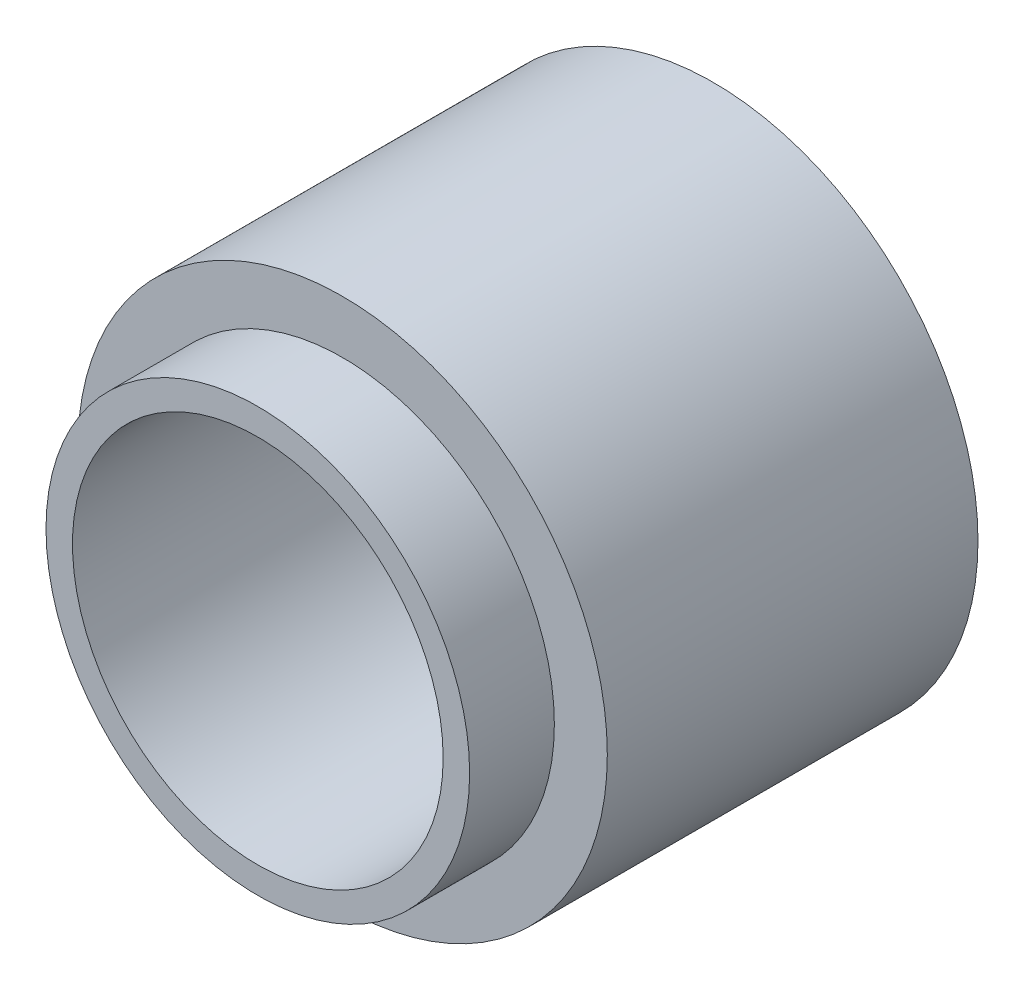
ISO-10303-21;
HEADER;
FILE_DESCRIPTION(('STEP AP214'),'2;1');
FILE_NAME('part.step','',(''),(''),'','','');
FILE_SCHEMA(('AUTOMOTIVE_DESIGN { 1 0 10303 214 1 1 1 1 }'));
ENDSEC;
DATA;
#1=APPLICATION_CONTEXT('core data for automotive mechanical design processes');
#2=APPLICATION_PROTOCOL_DEFINITION('international standard','automotive_design',2000,#1);
#3=PRODUCT_CONTEXT('',#1,'mechanical');
#4=PRODUCT('Part','Part','',(#3));
#5=PRODUCT_RELATED_PRODUCT_CATEGORY('part','',(#4));
#6=PRODUCT_DEFINITION_FORMATION('','',#4);
#7=PRODUCT_DEFINITION_CONTEXT('part definition',#1,'design');
#8=PRODUCT_DEFINITION('design','',#6,#7);
#9=PRODUCT_DEFINITION_SHAPE('','',#8);
#10=(LENGTH_UNIT() NAMED_UNIT(*) SI_UNIT(.MILLI.,.METRE.));
#11=(NAMED_UNIT(*) PLANE_ANGLE_UNIT() SI_UNIT($,.RADIAN.));
#12=(NAMED_UNIT(*) SI_UNIT($,.STERADIAN.) SOLID_ANGLE_UNIT());
#13=UNCERTAINTY_MEASURE_WITH_UNIT(LENGTH_MEASURE(1.E-05),#10,'distance_accuracy_value','');
#14=(GEOMETRIC_REPRESENTATION_CONTEXT(3) GLOBAL_UNCERTAINTY_ASSIGNED_CONTEXT((#13)) GLOBAL_UNIT_ASSIGNED_CONTEXT((#10,
#11,#12)) REPRESENTATION_CONTEXT('',''));
#15=CARTESIAN_POINT('',(0.,0.,0.));
#16=DIRECTION('',(0.,0.,1.));
#17=DIRECTION('',(1.,0.,0.));
#18=AXIS2_PLACEMENT_3D('',#15,#16,#17);
#19=CARTESIAN_POINT('',(0.,0.,7.));
#20=DIRECTION('',(0.,0.,1.));
#21=DIRECTION('',(1.,0.,0.));
#22=AXIS2_PLACEMENT_3D('',#19,#20,#21);
#23=PLANE('',#22);
#24=CARTESIAN_POINT('',(0.,0.,7.));
#25=DIRECTION('',(0.,0.,1.));
#26=DIRECTION('',(1.,0.,0.));
#27=AXIS2_PLACEMENT_3D('',#24,#25,#26);
#28=CIRCLE('',#27,5.);
#29=CARTESIAN_POINT('',(5.,0.,7.));
#30=VERTEX_POINT('',#29);
#31=EDGE_CURVE('E10',#30,#30,#28,.T.);
#32=ORIENTED_EDGE('',*,*,#31,.T.);
#33=EDGE_LOOP('',(#32));
#34=FACE_BOUND('',#33,.T.);
#35=CARTESIAN_POINT('',(0.,0.,7.));
#36=DIRECTION('',(0.,0.,1.));
#37=DIRECTION('',(1.,0.,0.));
#38=AXIS2_PLACEMENT_3D('',#35,#36,#37);
#39=CIRCLE('',#38,4.);
#40=CARTESIAN_POINT('',(4.,0.,7.));
#41=VERTEX_POINT('',#40);
#42=EDGE_CURVE('E52',#41,#41,#39,.T.);
#43=ORIENTED_EDGE('',*,*,#42,.F.);
#44=EDGE_LOOP('',(#43));
#45=FACE_BOUND('',#44,.T.);
#46=ADVANCED_FACE('F36',(#34,#45),#23,.T.);
#47=CARTESIAN_POINT('',(0.,0.,7.));
#48=DIRECTION('',(0.,0.,-1.));
#49=DIRECTION('',(-1.,0.,0.));
#50=AXIS2_PLACEMENT_3D('',#47,#48,#49);
#51=CYLINDRICAL_SURFACE('',#50,5.);
#52=ORIENTED_EDGE('',*,*,#31,.F.);
#53=EDGE_LOOP('',(#52));
#54=FACE_BOUND('',#53,.T.);
#55=CARTESIAN_POINT('',(0.,0.,0.));
#56=DIRECTION('',(0.,0.,1.));
#57=DIRECTION('',(1.,0.,0.));
#58=AXIS2_PLACEMENT_3D('',#55,#56,#57);
#59=CIRCLE('',#58,5.);
#60=CARTESIAN_POINT('',(5.,0.,0.));
#61=VERTEX_POINT('',#60);
#62=EDGE_CURVE('E40',#61,#61,#59,.T.);
#63=ORIENTED_EDGE('',*,*,#62,.T.);
#64=EDGE_LOOP('',(#63));
#65=FACE_BOUND('',#64,.T.);
#66=ADVANCED_FACE('F38',(#54,#65),#51,.T.);
#67=CARTESIAN_POINT('',(0.,0.,0.));
#68=DIRECTION('',(0.,0.,1.));
#69=DIRECTION('',(1.,0.,0.));
#70=AXIS2_PLACEMENT_3D('',#67,#68,#69);
#71=PLANE('',#70);
#72=CARTESIAN_POINT('',(0.,0.,0.));
#73=DIRECTION('',(0.,0.,1.));
#74=DIRECTION('',(1.,0.,0.));
#75=AXIS2_PLACEMENT_3D('',#72,#73,#74);
#76=CIRCLE('',#75,3.5);
#77=CARTESIAN_POINT('',(3.5,0.,0.));
#78=VERTEX_POINT('',#77);
#79=EDGE_CURVE('E47',#78,#78,#76,.T.);
#80=ORIENTED_EDGE('',*,*,#79,.T.);
#81=EDGE_LOOP('',(#80));
#82=FACE_BOUND('',#81,.T.);
#83=ORIENTED_EDGE('',*,*,#62,.F.);
#84=EDGE_LOOP('',(#83));
#85=FACE_BOUND('',#84,.T.);
#86=ADVANCED_FACE('F74',(#82,#85),#71,.F.);
#87=CARTESIAN_POINT('',(0.,0.,0.));
#88=DIRECTION('',(0.,0.,1.));
#89=DIRECTION('',(1.,0.,0.));
#90=AXIS2_PLACEMENT_3D('',#87,#88,#89);
#91=CYLINDRICAL_SURFACE('',#90,3.5);
#92=ORIENTED_EDGE('',*,*,#79,.F.);
#93=EDGE_LOOP('',(#92));
#94=FACE_BOUND('',#93,.T.);
#95=CARTESIAN_POINT('',(0.,0.,8.6));
#96=DIRECTION('',(0.,0.,1.));
#97=DIRECTION('',(1.,0.,0.));
#98=AXIS2_PLACEMENT_3D('',#95,#96,#97);
#99=CIRCLE('',#98,3.5);
#100=CARTESIAN_POINT('',(3.5,0.,8.6));
#101=VERTEX_POINT('',#100);
#102=EDGE_CURVE('E55',#101,#101,#99,.T.);
#103=ORIENTED_EDGE('',*,*,#102,.T.);
#104=EDGE_LOOP('',(#103));
#105=FACE_BOUND('',#104,.T.);
#106=ADVANCED_FACE('F61',(#94,#105),#91,.F.);
#107=CARTESIAN_POINT('',(0.,0.,8.6));
#108=DIRECTION('',(0.,0.,1.));
#109=DIRECTION('',(1.,0.,0.));
#110=AXIS2_PLACEMENT_3D('',#107,#108,#109);
#111=PLANE('',#110);
#112=CARTESIAN_POINT('',(0.,0.,8.6));
#113=DIRECTION('',(0.,0.,1.));
#114=DIRECTION('',(1.,0.,0.));
#115=AXIS2_PLACEMENT_3D('',#112,#113,#114);
#116=CIRCLE('',#115,4.);
#117=CARTESIAN_POINT('',(4.,0.,8.6));
#118=VERTEX_POINT('',#117);
#119=EDGE_CURVE('E51',#118,#118,#116,.T.);
#120=ORIENTED_EDGE('',*,*,#119,.T.);
#121=EDGE_LOOP('',(#120));
#122=FACE_BOUND('',#121,.T.);
#123=ORIENTED_EDGE('',*,*,#102,.F.);
#124=EDGE_LOOP('',(#123));
#125=FACE_BOUND('',#124,.T.);
#126=ADVANCED_FACE('F63',(#122,#125),#111,.T.);
#127=CARTESIAN_POINT('',(0.,0.,8.6));
#128=DIRECTION('',(0.,0.,-1.));
#129=DIRECTION('',(-1.,0.,0.));
#130=AXIS2_PLACEMENT_3D('',#127,#128,#129);
#131=CYLINDRICAL_SURFACE('',#130,4.);
#132=ORIENTED_EDGE('',*,*,#119,.F.);
#133=EDGE_LOOP('',(#132));
#134=FACE_BOUND('',#133,.T.);
#135=ORIENTED_EDGE('',*,*,#42,.T.);
#136=EDGE_LOOP('',(#135));
#137=FACE_BOUND('',#136,.T.);
#138=ADVANCED_FACE('F65',(#134,#137),#131,.T.);
#139=CLOSED_SHELL('',(#46,#66,#86,#106,#126,#138));
#140=MANIFOLD_SOLID_BREP('B2',#139);
#141=ADVANCED_BREP_SHAPE_REPRESENTATION('',(#18,#140),#14);
#142=SHAPE_DEFINITION_REPRESENTATION(#9,#141);
ENDSEC;
END-ISO-10303-21;
